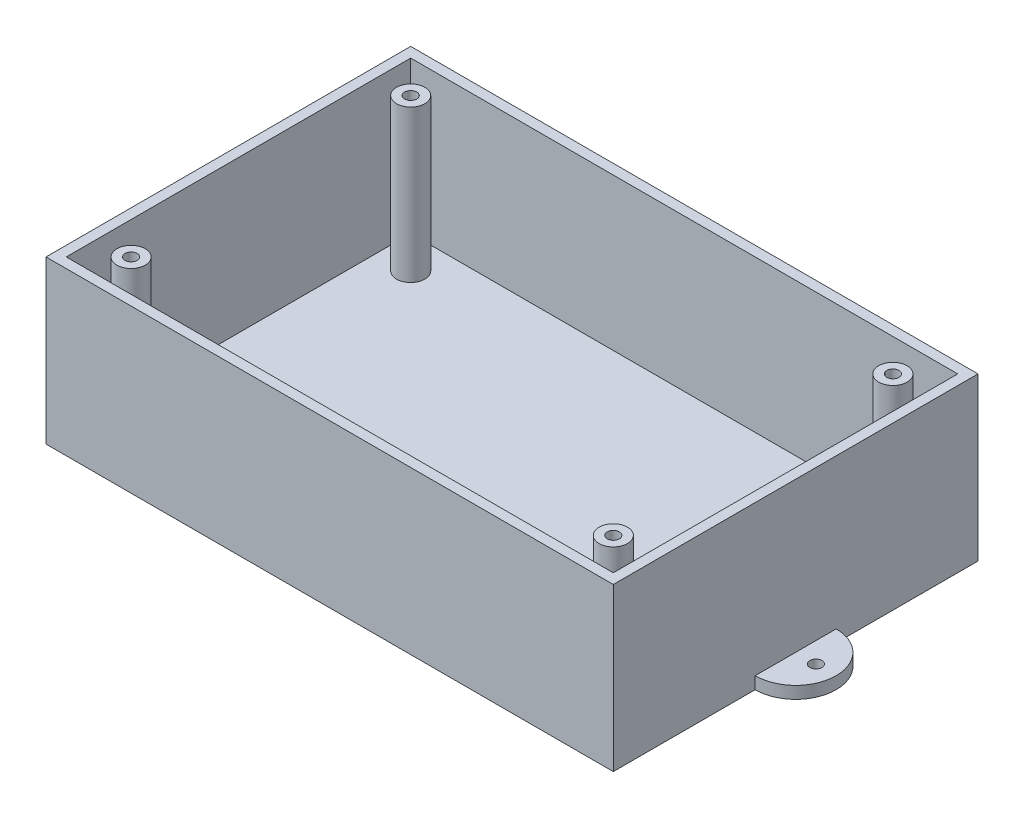
ISO-10303-21;
HEADER;
FILE_DESCRIPTION(('STEP AP214'),'2;1');
FILE_NAME('part.step','',(''),(''),'','','');
FILE_SCHEMA(('AUTOMOTIVE_DESIGN { 1 0 10303 214 1 1 1 1 }'));
ENDSEC;
DATA;
#1=APPLICATION_CONTEXT('core data for automotive mechanical design processes');
#2=APPLICATION_PROTOCOL_DEFINITION('international standard','automotive_design',2000,#1);
#3=PRODUCT_CONTEXT('',#1,'mechanical');
#4=PRODUCT('Part','Part','',(#3));
#5=PRODUCT_RELATED_PRODUCT_CATEGORY('part','',(#4));
#6=PRODUCT_DEFINITION_FORMATION('','',#4);
#7=PRODUCT_DEFINITION_CONTEXT('part definition',#1,'design');
#8=PRODUCT_DEFINITION('design','',#6,#7);
#9=PRODUCT_DEFINITION_SHAPE('','',#8);
#10=(LENGTH_UNIT() NAMED_UNIT(*) SI_UNIT(.MILLI.,.METRE.));
#11=(NAMED_UNIT(*) PLANE_ANGLE_UNIT() SI_UNIT($,.RADIAN.));
#12=(NAMED_UNIT(*) SI_UNIT($,.STERADIAN.) SOLID_ANGLE_UNIT());
#13=UNCERTAINTY_MEASURE_WITH_UNIT(LENGTH_MEASURE(1.E-05),#10,'distance_accuracy_value','');
#14=(GEOMETRIC_REPRESENTATION_CONTEXT(3) GLOBAL_UNCERTAINTY_ASSIGNED_CONTEXT((#13)) GLOBAL_UNIT_ASSIGNED_CONTEXT((#10,
#11,#12)) REPRESENTATION_CONTEXT('',''));
#15=CARTESIAN_POINT('',(0.,0.,0.));
#16=DIRECTION('',(0.,0.,1.));
#17=DIRECTION('',(1.,0.,0.));
#18=AXIS2_PLACEMENT_3D('',#15,#16,#17);
#19=CARTESIAN_POINT('',(0.,40.,0.));
#20=DIRECTION('',(1.,0.,0.));
#21=DIRECTION('',(0.,0.,-1.));
#22=AXIS2_PLACEMENT_3D('',#19,#20,#21);
#23=PLANE('',#22);
#24=DIRECTION('',(0.,-1.,0.));
#25=VECTOR('',#24,1.);
#26=CARTESIAN_POINT('',(0.,3.,-35.));
#27=LINE('',#26,#25);
#28=CARTESIAN_POINT('',(0.,3.,-35.));
#29=VERTEX_POINT('',#28);
#30=CARTESIAN_POINT('',(0.,0.,-35.));
#31=VERTEX_POINT('',#30);
#32=EDGE_CURVE('E166',#29,#31,#27,.T.);
#33=ORIENTED_EDGE('',*,*,#32,.T.);
#34=DIRECTION('',(0.,0.,1.));
#35=VECTOR('',#34,1.);
#36=CARTESIAN_POINT('',(0.,0.,0.));
#37=LINE('',#36,#35);
#38=CARTESIAN_POINT('',(0.,0.,0.));
#39=VERTEX_POINT('',#38);
#40=EDGE_CURVE('E245',#31,#39,#37,.T.);
#41=ORIENTED_EDGE('',*,*,#40,.T.);
#42=DIRECTION('',(0.,-1.,0.));
#43=VECTOR('',#42,1.);
#44=CARTESIAN_POINT('',(0.,40.,0.));
#45=LINE('',#44,#43);
#46=CARTESIAN_POINT('',(0.,40.,0.));
#47=VERTEX_POINT('',#46);
#48=EDGE_CURVE('E11',#47,#39,#45,.T.);
#49=ORIENTED_EDGE('',*,*,#48,.F.);
#50=DIRECTION('',(0.,0.,1.));
#51=VECTOR('',#50,1.);
#52=CARTESIAN_POINT('',(0.,40.,0.));
#53=LINE('',#52,#51);
#54=CARTESIAN_POINT('',(0.,40.,-90.));
#55=VERTEX_POINT('',#54);
#56=EDGE_CURVE('E252',#55,#47,#53,.T.);
#57=ORIENTED_EDGE('',*,*,#56,.F.);
#58=DIRECTION('',(0.,-1.,0.));
#59=VECTOR('',#58,1.);
#60=CARTESIAN_POINT('',(0.,40.,-90.));
#61=LINE('',#60,#59);
#62=CARTESIAN_POINT('',(0.,0.,-90.));
#63=VERTEX_POINT('',#62);
#64=EDGE_CURVE('E261',#55,#63,#61,.T.);
#65=ORIENTED_EDGE('',*,*,#64,.T.);
#66=CARTESIAN_POINT('',(0.,0.,-55.));
#67=VERTEX_POINT('',#66);
#68=EDGE_CURVE('E262',#63,#67,#37,.T.);
#69=ORIENTED_EDGE('',*,*,#68,.T.);
#70=DIRECTION('',(0.,-1.,0.));
#71=VECTOR('',#70,1.);
#72=CARTESIAN_POINT('',(0.,3.,-55.));
#73=LINE('',#72,#71);
#74=CARTESIAN_POINT('',(0.,3.,-55.));
#75=VERTEX_POINT('',#74);
#76=EDGE_CURVE('E163',#75,#67,#73,.T.);
#77=ORIENTED_EDGE('',*,*,#76,.F.);
#78=DIRECTION('',(0.,0.,-1.));
#79=VECTOR('',#78,1.);
#80=CARTESIAN_POINT('',(0.,3.,0.));
#81=LINE('',#80,#79);
#82=EDGE_CURVE('E160',#29,#75,#81,.T.);
#83=ORIENTED_EDGE('',*,*,#82,.F.);
#84=EDGE_LOOP('',(#33,#41,#49,#57,#65,#69,#77,#83));
#85=FACE_BOUND('',#84,.T.);
#86=ADVANCED_FACE('F40',(#85),#23,.F.);
#87=CARTESIAN_POINT('',(0.,40.,0.));
#88=DIRECTION('',(0.,0.,-1.));
#89=DIRECTION('',(-1.,0.,0.));
#90=AXIS2_PLACEMENT_3D('',#87,#88,#89);
#91=PLANE('',#90);
#92=DIRECTION('',(1.,0.,0.));
#93=VECTOR('',#92,1.);
#94=CARTESIAN_POINT('',(0.,0.,0.));
#95=LINE('',#94,#93);
#96=CARTESIAN_POINT('',(140.,0.,0.));
#97=VERTEX_POINT('',#96);
#98=EDGE_CURVE('E139',#39,#97,#95,.T.);
#99=ORIENTED_EDGE('',*,*,#98,.T.);
#100=DIRECTION('',(0.,-1.,0.));
#101=VECTOR('',#100,1.);
#102=CARTESIAN_POINT('',(140.,40.,0.));
#103=LINE('',#102,#101);
#104=CARTESIAN_POINT('',(140.,40.,0.));
#105=VERTEX_POINT('',#104);
#106=EDGE_CURVE('E48',#105,#97,#103,.T.);
#107=ORIENTED_EDGE('',*,*,#106,.F.);
#108=DIRECTION('',(1.,0.,0.));
#109=VECTOR('',#108,1.);
#110=CARTESIAN_POINT('',(0.,40.,0.));
#111=LINE('',#110,#109);
#112=EDGE_CURVE('E255',#47,#105,#111,.T.);
#113=ORIENTED_EDGE('',*,*,#112,.F.);
#114=ORIENTED_EDGE('',*,*,#48,.T.);
#115=EDGE_LOOP('',(#99,#107,#113,#114));
#116=FACE_BOUND('',#115,.T.);
#117=ADVANCED_FACE('F304',(#116),#91,.F.);
#118=CARTESIAN_POINT('',(140.,40.,0.));
#119=DIRECTION('',(-1.,0.,0.));
#120=DIRECTION('',(0.,0.,1.));
#121=AXIS2_PLACEMENT_3D('',#118,#119,#120);
#122=PLANE('',#121);
#123=DIRECTION('',(0.,0.,1.));
#124=VECTOR('',#123,1.);
#125=CARTESIAN_POINT('',(140.,3.,0.));
#126=LINE('',#125,#124);
#127=CARTESIAN_POINT('',(140.,3.,-55.));
#128=VERTEX_POINT('',#127);
#129=CARTESIAN_POINT('',(140.,3.,-35.));
#130=VERTEX_POINT('',#129);
#131=EDGE_CURVE('E60',#128,#130,#126,.T.);
#132=ORIENTED_EDGE('',*,*,#131,.F.);
#133=DIRECTION('',(0.,-1.,0.));
#134=VECTOR('',#133,1.);
#135=CARTESIAN_POINT('',(140.,3.,-55.));
#136=LINE('',#135,#134);
#137=CARTESIAN_POINT('',(140.,0.,-55.));
#138=VERTEX_POINT('',#137);
#139=EDGE_CURVE('E141',#128,#138,#136,.T.);
#140=ORIENTED_EDGE('',*,*,#139,.T.);
#141=DIRECTION('',(0.,0.,-1.));
#142=VECTOR('',#141,1.);
#143=CARTESIAN_POINT('',(140.,0.,0.));
#144=LINE('',#143,#142);
#145=CARTESIAN_POINT('',(140.,0.,-90.));
#146=VERTEX_POINT('',#145);
#147=EDGE_CURVE('E129',#138,#146,#144,.T.);
#148=ORIENTED_EDGE('',*,*,#147,.T.);
#149=DIRECTION('',(0.,-1.,0.));
#150=VECTOR('',#149,1.);
#151=CARTESIAN_POINT('',(140.,40.,-90.));
#152=LINE('',#151,#150);
#153=CARTESIAN_POINT('',(140.,40.,-90.));
#154=VERTEX_POINT('',#153);
#155=EDGE_CURVE('E268',#154,#146,#152,.T.);
#156=ORIENTED_EDGE('',*,*,#155,.F.);
#157=DIRECTION('',(0.,0.,-1.));
#158=VECTOR('',#157,1.);
#159=CARTESIAN_POINT('',(140.,40.,0.));
#160=LINE('',#159,#158);
#161=EDGE_CURVE('E257',#105,#154,#160,.T.);
#162=ORIENTED_EDGE('',*,*,#161,.F.);
#163=ORIENTED_EDGE('',*,*,#106,.T.);
#164=CARTESIAN_POINT('',(140.,0.,-35.));
#165=VERTEX_POINT('',#164);
#166=EDGE_CURVE('E138',#97,#165,#144,.T.);
#167=ORIENTED_EDGE('',*,*,#166,.T.);
#168=DIRECTION('',(0.,-1.,0.));
#169=VECTOR('',#168,1.);
#170=CARTESIAN_POINT('',(140.,3.,-35.));
#171=LINE('',#170,#169);
#172=EDGE_CURVE('E56',#130,#165,#171,.T.);
#173=ORIENTED_EDGE('',*,*,#172,.F.);
#174=EDGE_LOOP('',(#132,#140,#148,#156,#162,#163,#167,#173));
#175=FACE_BOUND('',#174,.T.);
#176=ADVANCED_FACE('F142',(#175),#122,.F.);
#177=CARTESIAN_POINT('',(0.,40.,-90.));
#178=DIRECTION('',(0.,0.,1.));
#179=DIRECTION('',(1.,0.,0.));
#180=AXIS2_PLACEMENT_3D('',#177,#178,#179);
#181=PLANE('',#180);
#182=DIRECTION('',(-1.,0.,0.));
#183=VECTOR('',#182,1.);
#184=CARTESIAN_POINT('',(0.,0.,-90.));
#185=LINE('',#184,#183);
#186=EDGE_CURVE('E135',#146,#63,#185,.T.);
#187=ORIENTED_EDGE('',*,*,#186,.T.);
#188=ORIENTED_EDGE('',*,*,#64,.F.);
#189=DIRECTION('',(-1.,0.,0.));
#190=VECTOR('',#189,1.);
#191=CARTESIAN_POINT('',(0.,40.,-90.));
#192=LINE('',#191,#190);
#193=EDGE_CURVE('E259',#154,#55,#192,.T.);
#194=ORIENTED_EDGE('',*,*,#193,.F.);
#195=ORIENTED_EDGE('',*,*,#155,.T.);
#196=EDGE_LOOP('',(#187,#188,#194,#195));
#197=FACE_BOUND('',#196,.T.);
#198=ADVANCED_FACE('F299',(#197),#181,.F.);
#199=CARTESIAN_POINT('',(0.,40.,0.));
#200=DIRECTION('',(0.,-1.,0.));
#201=DIRECTION('',(0.,0.,-1.));
#202=AXIS2_PLACEMENT_3D('',#199,#200,#201);
#203=PLANE('',#202);
#204=DIRECTION('',(-1.,0.,0.));
#205=VECTOR('',#204,1.);
#206=CARTESIAN_POINT('',(2.5,40.,-87.5));
#207=LINE('',#206,#205);
#208=CARTESIAN_POINT('',(137.5,40.,-87.5));
#209=VERTEX_POINT('',#208);
#210=CARTESIAN_POINT('',(2.5,40.,-87.5));
#211=VERTEX_POINT('',#210);
#212=EDGE_CURVE('E235',#209,#211,#207,.T.);
#213=ORIENTED_EDGE('',*,*,#212,.F.);
#214=DIRECTION('',(0.,0.,-1.));
#215=VECTOR('',#214,1.);
#216=CARTESIAN_POINT('',(137.5,40.,-87.5));
#217=LINE('',#216,#215);
#218=CARTESIAN_POINT('',(137.5,40.,-2.50000000000001));
#219=VERTEX_POINT('',#218);
#220=EDGE_CURVE('E217',#219,#209,#217,.T.);
#221=ORIENTED_EDGE('',*,*,#220,.F.);
#222=DIRECTION('',(1.,0.,0.));
#223=VECTOR('',#222,1.);
#224=CARTESIAN_POINT('',(2.5,40.,-2.50000000000001));
#225=LINE('',#224,#223);
#226=CARTESIAN_POINT('',(2.5,40.,-2.50000000000001));
#227=VERTEX_POINT('',#226);
#228=EDGE_CURVE('E224',#227,#219,#225,.T.);
#229=ORIENTED_EDGE('',*,*,#228,.F.);
#230=DIRECTION('',(0.,0.,1.));
#231=VECTOR('',#230,1.);
#232=CARTESIAN_POINT('',(2.5,40.,-87.5));
#233=LINE('',#232,#231);
#234=EDGE_CURVE('E238',#211,#227,#233,.T.);
#235=ORIENTED_EDGE('',*,*,#234,.F.);
#236=EDGE_LOOP('',(#213,#221,#229,#235));
#237=FACE_BOUND('',#236,.T.);
#238=ORIENTED_EDGE('',*,*,#56,.T.);
#239=ORIENTED_EDGE('',*,*,#112,.T.);
#240=ORIENTED_EDGE('',*,*,#161,.T.);
#241=ORIENTED_EDGE('',*,*,#193,.T.);
#242=EDGE_LOOP('',(#238,#239,#240,#241));
#243=FACE_BOUND('',#242,.T.);
#244=ADVANCED_FACE('F289',(#237,#243),#203,.F.);
#245=CARTESIAN_POINT('',(0.,0.,0.));
#246=DIRECTION('',(0.,-1.,0.));
#247=DIRECTION('',(0.,0.,-1.));
#248=AXIS2_PLACEMENT_3D('',#245,#246,#247);
#249=PLANE('',#248);
#250=CARTESIAN_POINT('',(-4.99999999999999,0.,-45.));
#251=DIRECTION('',(0.,-1.,0.));
#252=DIRECTION('',(0.,0.,-1.));
#253=AXIS2_PLACEMENT_3D('',#250,#251,#252);
#254=CIRCLE('',#253,1.5);
#255=CARTESIAN_POINT('',(-4.99999999999999,0.,-46.5));
#256=VERTEX_POINT('',#255);
#257=EDGE_CURVE('E272',#256,#256,#254,.T.);
#258=ORIENTED_EDGE('',*,*,#257,.F.);
#259=EDGE_LOOP('',(#258));
#260=FACE_BOUND('',#259,.T.);
#261=CARTESIAN_POINT('',(145.,0.,-45.));
#262=DIRECTION('',(0.,-1.,0.));
#263=DIRECTION('',(0.,0.,-1.));
#264=AXIS2_PLACEMENT_3D('',#261,#262,#263);
#265=CIRCLE('',#264,1.5);
#266=CARTESIAN_POINT('',(145.,0.,-46.5));
#267=VERTEX_POINT('',#266);
#268=EDGE_CURVE('E276',#267,#267,#265,.T.);
#269=ORIENTED_EDGE('',*,*,#268,.F.);
#270=EDGE_LOOP('',(#269));
#271=FACE_BOUND('',#270,.T.);
#272=ORIENTED_EDGE('',*,*,#68,.F.);
#273=ORIENTED_EDGE('',*,*,#186,.F.);
#274=ORIENTED_EDGE('',*,*,#147,.F.);
#275=CARTESIAN_POINT('',(140.,0.,-45.));
#276=DIRECTION('',(0.,-1.,0.));
#277=DIRECTION('',(0.,0.,-1.));
#278=AXIS2_PLACEMENT_3D('',#275,#276,#277);
#279=CIRCLE('',#278,10.);
#280=EDGE_CURVE('E134',#138,#165,#279,.T.);
#281=ORIENTED_EDGE('',*,*,#280,.T.);
#282=ORIENTED_EDGE('',*,*,#166,.F.);
#283=ORIENTED_EDGE('',*,*,#98,.F.);
#284=ORIENTED_EDGE('',*,*,#40,.F.);
#285=CARTESIAN_POINT('',(0.,0.,-45.));
#286=DIRECTION('',(0.,-1.,0.));
#287=DIRECTION('',(0.,0.,-1.));
#288=AXIS2_PLACEMENT_3D('',#285,#286,#287);
#289=CIRCLE('',#288,10.);
#290=EDGE_CURVE('E155',#67,#31,#289,.F.);
#291=ORIENTED_EDGE('',*,*,#290,.F.);
#292=EDGE_LOOP('',(#272,#273,#274,#281,#282,#283,#284,#291));
#293=FACE_BOUND('',#292,.T.);
#294=ADVANCED_FACE('F131',(#260,#271,#293),#249,.T.);
#295=CARTESIAN_POINT('',(137.5,2.5,-87.5));
#296=DIRECTION('',(1.,0.,0.));
#297=DIRECTION('',(0.,0.,-1.));
#298=AXIS2_PLACEMENT_3D('',#295,#296,#297);
#299=PLANE('',#298);
#300=ORIENTED_EDGE('',*,*,#220,.T.);
#301=DIRECTION('',(0.,1.,0.));
#302=VECTOR('',#301,1.);
#303=CARTESIAN_POINT('',(137.5,2.5,-87.5));
#304=LINE('',#303,#302);
#305=CARTESIAN_POINT('',(137.5,2.5,-87.5));
#306=VERTEX_POINT('',#305);
#307=EDGE_CURVE('E233',#306,#209,#304,.T.);
#308=ORIENTED_EDGE('',*,*,#307,.F.);
#309=DIRECTION('',(0.,0.,-1.));
#310=VECTOR('',#309,1.);
#311=CARTESIAN_POINT('',(137.5,2.5,-87.5));
#312=LINE('',#311,#310);
#313=CARTESIAN_POINT('',(137.5,2.5,-2.50000000000001));
#314=VERTEX_POINT('',#313);
#315=EDGE_CURVE('E220',#314,#306,#312,.T.);
#316=ORIENTED_EDGE('',*,*,#315,.F.);
#317=DIRECTION('',(0.,1.,0.));
#318=VECTOR('',#317,1.);
#319=CARTESIAN_POINT('',(137.5,2.5,-2.50000000000001));
#320=LINE('',#319,#318);
#321=EDGE_CURVE('E243',#314,#219,#320,.T.);
#322=ORIENTED_EDGE('',*,*,#321,.T.);
#323=EDGE_LOOP('',(#300,#308,#316,#322));
#324=FACE_BOUND('',#323,.T.);
#325=ADVANCED_FACE('F288',(#324),#299,.F.);
#326=CARTESIAN_POINT('',(2.5,2.5,-2.50000000000001));
#327=DIRECTION('',(0.,0.,1.));
#328=DIRECTION('',(1.,0.,0.));
#329=AXIS2_PLACEMENT_3D('',#326,#327,#328);
#330=PLANE('',#329);
#331=ORIENTED_EDGE('',*,*,#228,.T.);
#332=ORIENTED_EDGE('',*,*,#321,.F.);
#333=DIRECTION('',(1.,0.,0.));
#334=VECTOR('',#333,1.);
#335=CARTESIAN_POINT('',(2.5,2.5,-2.50000000000001));
#336=LINE('',#335,#334);
#337=CARTESIAN_POINT('',(2.5,2.5,-2.50000000000001));
#338=VERTEX_POINT('',#337);
#339=EDGE_CURVE('E230',#338,#314,#336,.T.);
#340=ORIENTED_EDGE('',*,*,#339,.F.);
#341=DIRECTION('',(0.,1.,0.));
#342=VECTOR('',#341,1.);
#343=CARTESIAN_POINT('',(2.5,2.5,-2.50000000000001));
#344=LINE('',#343,#342);
#345=EDGE_CURVE('E246',#338,#227,#344,.T.);
#346=ORIENTED_EDGE('',*,*,#345,.T.);
#347=EDGE_LOOP('',(#331,#332,#340,#346));
#348=FACE_BOUND('',#347,.T.);
#349=ADVANCED_FACE('F296',(#348),#330,.F.);
#350=CARTESIAN_POINT('',(2.5,2.5,-87.5));
#351=DIRECTION('',(-1.,0.,0.));
#352=DIRECTION('',(0.,0.,1.));
#353=AXIS2_PLACEMENT_3D('',#350,#351,#352);
#354=PLANE('',#353);
#355=ORIENTED_EDGE('',*,*,#234,.T.);
#356=ORIENTED_EDGE('',*,*,#345,.F.);
#357=DIRECTION('',(0.,0.,1.));
#358=VECTOR('',#357,1.);
#359=CARTESIAN_POINT('',(2.5,2.5,-87.5));
#360=LINE('',#359,#358);
#361=CARTESIAN_POINT('',(2.5,2.5,-87.5));
#362=VERTEX_POINT('',#361);
#363=EDGE_CURVE('E227',#362,#338,#360,.T.);
#364=ORIENTED_EDGE('',*,*,#363,.F.);
#365=DIRECTION('',(0.,1.,0.));
#366=VECTOR('',#365,1.);
#367=CARTESIAN_POINT('',(2.5,2.5,-87.5));
#368=LINE('',#367,#366);
#369=EDGE_CURVE('E248',#362,#211,#368,.T.);
#370=ORIENTED_EDGE('',*,*,#369,.T.);
#371=EDGE_LOOP('',(#355,#356,#364,#370));
#372=FACE_BOUND('',#371,.T.);
#373=ADVANCED_FACE('F362',(#372),#354,.F.);
#374=CARTESIAN_POINT('',(2.5,2.5,-87.5));
#375=DIRECTION('',(0.,0.,-1.));
#376=DIRECTION('',(-1.,0.,0.));
#377=AXIS2_PLACEMENT_3D('',#374,#375,#376);
#378=PLANE('',#377);
#379=ORIENTED_EDGE('',*,*,#212,.T.);
#380=ORIENTED_EDGE('',*,*,#369,.F.);
#381=DIRECTION('',(-1.,0.,0.));
#382=VECTOR('',#381,1.);
#383=CARTESIAN_POINT('',(2.5,2.5,-87.5));
#384=LINE('',#383,#382);
#385=EDGE_CURVE('E223',#306,#362,#384,.T.);
#386=ORIENTED_EDGE('',*,*,#385,.F.);
#387=ORIENTED_EDGE('',*,*,#307,.T.);
#388=EDGE_LOOP('',(#379,#380,#386,#387));
#389=FACE_BOUND('',#388,.T.);
#390=ADVANCED_FACE('F372',(#389),#378,.F.);
#391=CARTESIAN_POINT('',(0.,2.5,0.));
#392=DIRECTION('',(0.,1.,0.));
#393=DIRECTION('',(0.,0.,1.));
#394=AXIS2_PLACEMENT_3D('',#391,#392,#393);
#395=PLANE('',#394);
#396=CARTESIAN_POINT('',(129.5,2.5,-79.5));
#397=DIRECTION('',(0.,1.,0.));
#398=DIRECTION('',(0.,0.,1.));
#399=AXIS2_PLACEMENT_3D('',#396,#397,#398);
#400=CIRCLE('',#399,3.49999999999999);
#401=CARTESIAN_POINT('',(129.5,2.5,-76.));
#402=VERTEX_POINT('',#401);
#403=EDGE_CURVE('E193',#402,#402,#400,.T.);
#404=ORIENTED_EDGE('',*,*,#403,.F.);
#405=EDGE_LOOP('',(#404));
#406=FACE_BOUND('',#405,.T.);
#407=CARTESIAN_POINT('',(129.5,2.5,-10.5));
#408=DIRECTION('',(0.,1.,0.));
#409=DIRECTION('',(0.,0.,1.));
#410=AXIS2_PLACEMENT_3D('',#407,#408,#409);
#411=CIRCLE('',#410,3.49999999999999);
#412=CARTESIAN_POINT('',(129.5,2.5,-7.00000000000002));
#413=VERTEX_POINT('',#412);
#414=EDGE_CURVE('E199',#413,#413,#411,.T.);
#415=ORIENTED_EDGE('',*,*,#414,.F.);
#416=EDGE_LOOP('',(#415));
#417=FACE_BOUND('',#416,.T.);
#418=CARTESIAN_POINT('',(10.5,2.5,-10.5));
#419=DIRECTION('',(0.,1.,0.));
#420=DIRECTION('',(0.,0.,1.));
#421=AXIS2_PLACEMENT_3D('',#418,#419,#420);
#422=CIRCLE('',#421,3.5);
#423=CARTESIAN_POINT('',(10.5,2.5,-7.00000000000001));
#424=VERTEX_POINT('',#423);
#425=EDGE_CURVE('E205',#424,#424,#422,.T.);
#426=ORIENTED_EDGE('',*,*,#425,.F.);
#427=EDGE_LOOP('',(#426));
#428=FACE_BOUND('',#427,.T.);
#429=CARTESIAN_POINT('',(10.5,2.5,-79.5));
#430=DIRECTION('',(0.,1.,0.));
#431=DIRECTION('',(0.,0.,1.));
#432=AXIS2_PLACEMENT_3D('',#429,#430,#431);
#433=CIRCLE('',#432,3.5);
#434=CARTESIAN_POINT('',(10.5,2.5,-76.));
#435=VERTEX_POINT('',#434);
#436=EDGE_CURVE('E211',#435,#435,#433,.T.);
#437=ORIENTED_EDGE('',*,*,#436,.F.);
#438=EDGE_LOOP('',(#437));
#439=FACE_BOUND('',#438,.T.);
#440=ORIENTED_EDGE('',*,*,#315,.T.);
#441=ORIENTED_EDGE('',*,*,#385,.T.);
#442=ORIENTED_EDGE('',*,*,#363,.T.);
#443=ORIENTED_EDGE('',*,*,#339,.T.);
#444=EDGE_LOOP('',(#440,#441,#442,#443));
#445=FACE_BOUND('',#444,.T.);
#446=ADVANCED_FACE('F382',(#406,#417,#428,#439,#445),#395,.T.);
#447=CARTESIAN_POINT('',(10.5,40.,-79.5));
#448=DIRECTION('',(0.,-1.,0.));
#449=DIRECTION('',(0.,0.,-1.));
#450=AXIS2_PLACEMENT_3D('',#447,#448,#449);
#451=CYLINDRICAL_SURFACE('',#450,3.5);
#452=CARTESIAN_POINT('',(10.5,40.,-79.5));
#453=DIRECTION('',(0.,1.,0.));
#454=DIRECTION('',(0.,0.,1.));
#455=AXIS2_PLACEMENT_3D('',#452,#453,#454);
#456=CIRCLE('',#455,3.5);
#457=CARTESIAN_POINT('',(10.5,40.,-76.));
#458=VERTEX_POINT('',#457);
#459=EDGE_CURVE('E214',#458,#458,#456,.T.);
#460=ORIENTED_EDGE('',*,*,#459,.F.);
#461=EDGE_LOOP('',(#460));
#462=FACE_BOUND('',#461,.T.);
#463=ORIENTED_EDGE('',*,*,#436,.T.);
#464=EDGE_LOOP('',(#463));
#465=FACE_BOUND('',#464,.T.);
#466=ADVANCED_FACE('F392',(#462,#465),#451,.T.);
#467=CARTESIAN_POINT('',(10.5,40.,-79.5));
#468=DIRECTION('',(0.,1.,0.));
#469=DIRECTION('',(0.,0.,1.));
#470=AXIS2_PLACEMENT_3D('',#467,#468,#469);
#471=PLANE('',#470);
#472=CARTESIAN_POINT('',(10.5,40.,-79.5));
#473=DIRECTION('',(0.,1.,0.));
#474=DIRECTION('',(0.,0.,1.));
#475=AXIS2_PLACEMENT_3D('',#472,#473,#474);
#476=CIRCLE('',#475,1.5);
#477=CARTESIAN_POINT('',(10.5,40.,-78.));
#478=VERTEX_POINT('',#477);
#479=EDGE_CURVE('E181',#478,#478,#476,.T.);
#480=ORIENTED_EDGE('',*,*,#479,.F.);
#481=EDGE_LOOP('',(#480));
#482=FACE_BOUND('',#481,.T.);
#483=ORIENTED_EDGE('',*,*,#459,.T.);
#484=EDGE_LOOP('',(#483));
#485=FACE_BOUND('',#484,.T.);
#486=ADVANCED_FACE('F402',(#482,#485),#471,.T.);
#487=CARTESIAN_POINT('',(10.5,40.,-10.5));
#488=DIRECTION('',(0.,-1.,0.));
#489=DIRECTION('',(0.,0.,-1.));
#490=AXIS2_PLACEMENT_3D('',#487,#488,#489);
#491=CYLINDRICAL_SURFACE('',#490,3.5);
#492=CARTESIAN_POINT('',(10.5,40.,-10.5));
#493=DIRECTION('',(0.,1.,0.));
#494=DIRECTION('',(0.,0.,1.));
#495=AXIS2_PLACEMENT_3D('',#492,#493,#494);
#496=CIRCLE('',#495,3.5);
#497=CARTESIAN_POINT('',(10.5,40.,-7.00000000000001));
#498=VERTEX_POINT('',#497);
#499=EDGE_CURVE('E208',#498,#498,#496,.T.);
#500=ORIENTED_EDGE('',*,*,#499,.F.);
#501=EDGE_LOOP('',(#500));
#502=FACE_BOUND('',#501,.T.);
#503=ORIENTED_EDGE('',*,*,#425,.T.);
#504=EDGE_LOOP('',(#503));
#505=FACE_BOUND('',#504,.T.);
#506=ADVANCED_FACE('F410',(#502,#505),#491,.T.);
#507=CARTESIAN_POINT('',(10.5,40.,-10.5));
#508=DIRECTION('',(0.,1.,0.));
#509=DIRECTION('',(0.,0.,1.));
#510=AXIS2_PLACEMENT_3D('',#507,#508,#509);
#511=PLANE('',#510);
#512=CARTESIAN_POINT('',(10.5,40.,-10.5));
#513=DIRECTION('',(0.,1.,0.));
#514=DIRECTION('',(0.,0.,1.));
#515=AXIS2_PLACEMENT_3D('',#512,#513,#514);
#516=CIRCLE('',#515,1.5);
#517=CARTESIAN_POINT('',(10.5,40.,-9.00000000000001));
#518=VERTEX_POINT('',#517);
#519=EDGE_CURVE('E175',#518,#518,#516,.T.);
#520=ORIENTED_EDGE('',*,*,#519,.F.);
#521=EDGE_LOOP('',(#520));
#522=FACE_BOUND('',#521,.T.);
#523=ORIENTED_EDGE('',*,*,#499,.T.);
#524=EDGE_LOOP('',(#523));
#525=FACE_BOUND('',#524,.T.);
#526=ADVANCED_FACE('F415',(#522,#525),#511,.T.);
#527=CARTESIAN_POINT('',(129.5,40.,-10.5));
#528=DIRECTION('',(0.,-1.,0.));
#529=DIRECTION('',(0.,0.,-1.));
#530=AXIS2_PLACEMENT_3D('',#527,#528,#529);
#531=CYLINDRICAL_SURFACE('',#530,3.49999999999999);
#532=CARTESIAN_POINT('',(129.5,40.,-10.5));
#533=DIRECTION('',(0.,1.,0.));
#534=DIRECTION('',(0.,0.,1.));
#535=AXIS2_PLACEMENT_3D('',#532,#533,#534);
#536=CIRCLE('',#535,3.49999999999999);
#537=CARTESIAN_POINT('',(129.5,40.,-7.00000000000002));
#538=VERTEX_POINT('',#537);
#539=EDGE_CURVE('E202',#538,#538,#536,.T.);
#540=ORIENTED_EDGE('',*,*,#539,.F.);
#541=EDGE_LOOP('',(#540));
#542=FACE_BOUND('',#541,.T.);
#543=ORIENTED_EDGE('',*,*,#414,.T.);
#544=EDGE_LOOP('',(#543));
#545=FACE_BOUND('',#544,.T.);
#546=ADVANCED_FACE('F423',(#542,#545),#531,.T.);
#547=CARTESIAN_POINT('',(129.5,40.,-10.5));
#548=DIRECTION('',(0.,1.,0.));
#549=DIRECTION('',(0.,0.,1.));
#550=AXIS2_PLACEMENT_3D('',#547,#548,#549);
#551=PLANE('',#550);
#552=CARTESIAN_POINT('',(129.5,40.,-10.5));
#553=DIRECTION('',(0.,1.,0.));
#554=DIRECTION('',(0.,0.,1.));
#555=AXIS2_PLACEMENT_3D('',#552,#553,#554);
#556=CIRCLE('',#555,1.5);
#557=CARTESIAN_POINT('',(129.5,40.,-9.00000000000001));
#558=VERTEX_POINT('',#557);
#559=EDGE_CURVE('E169',#558,#558,#556,.T.);
#560=ORIENTED_EDGE('',*,*,#559,.F.);
#561=EDGE_LOOP('',(#560));
#562=FACE_BOUND('',#561,.T.);
#563=ORIENTED_EDGE('',*,*,#539,.T.);
#564=EDGE_LOOP('',(#563));
#565=FACE_BOUND('',#564,.T.);
#566=ADVANCED_FACE('F428',(#562,#565),#551,.T.);
#567=CARTESIAN_POINT('',(129.5,40.,-79.5));
#568=DIRECTION('',(0.,-1.,0.));
#569=DIRECTION('',(0.,0.,-1.));
#570=AXIS2_PLACEMENT_3D('',#567,#568,#569);
#571=CYLINDRICAL_SURFACE('',#570,3.49999999999999);
#572=CARTESIAN_POINT('',(129.5,40.,-79.5));
#573=DIRECTION('',(0.,1.,0.));
#574=DIRECTION('',(0.,0.,1.));
#575=AXIS2_PLACEMENT_3D('',#572,#573,#574);
#576=CIRCLE('',#575,3.49999999999999);
#577=CARTESIAN_POINT('',(129.5,40.,-76.));
#578=VERTEX_POINT('',#577);
#579=EDGE_CURVE('E196',#578,#578,#576,.T.);
#580=ORIENTED_EDGE('',*,*,#579,.F.);
#581=EDGE_LOOP('',(#580));
#582=FACE_BOUND('',#581,.T.);
#583=ORIENTED_EDGE('',*,*,#403,.T.);
#584=EDGE_LOOP('',(#583));
#585=FACE_BOUND('',#584,.T.);
#586=ADVANCED_FACE('F436',(#582,#585),#571,.T.);
#587=CARTESIAN_POINT('',(129.5,40.,-79.5));
#588=DIRECTION('',(0.,1.,0.));
#589=DIRECTION('',(0.,0.,1.));
#590=AXIS2_PLACEMENT_3D('',#587,#588,#589);
#591=PLANE('',#590);
#592=CARTESIAN_POINT('',(129.5,40.,-79.5));
#593=DIRECTION('',(0.,1.,0.));
#594=DIRECTION('',(0.,0.,1.));
#595=AXIS2_PLACEMENT_3D('',#592,#593,#594);
#596=CIRCLE('',#595,1.5);
#597=CARTESIAN_POINT('',(129.5,40.,-78.));
#598=VERTEX_POINT('',#597);
#599=EDGE_CURVE('E182',#598,#598,#596,.T.);
#600=ORIENTED_EDGE('',*,*,#599,.F.);
#601=EDGE_LOOP('',(#600));
#602=FACE_BOUND('',#601,.T.);
#603=ORIENTED_EDGE('',*,*,#579,.T.);
#604=EDGE_LOOP('',(#603));
#605=FACE_BOUND('',#604,.T.);
#606=ADVANCED_FACE('F441',(#602,#605),#591,.T.);
#607=CARTESIAN_POINT('',(129.5,2.5,-79.5));
#608=DIRECTION('',(0.,1.,0.));
#609=DIRECTION('',(0.,0.,1.));
#610=AXIS2_PLACEMENT_3D('',#607,#608,#609);
#611=CYLINDRICAL_SURFACE('',#610,1.5);
#612=CARTESIAN_POINT('',(129.5,2.5,-79.5));
#613=DIRECTION('',(0.,1.,0.));
#614=DIRECTION('',(0.,0.,1.));
#615=AXIS2_PLACEMENT_3D('',#612,#613,#614);
#616=CIRCLE('',#615,1.5);
#617=CARTESIAN_POINT('',(129.5,2.5,-78.));
#618=VERTEX_POINT('',#617);
#619=EDGE_CURVE('E178',#618,#618,#616,.T.);
#620=ORIENTED_EDGE('',*,*,#619,.F.);
#621=EDGE_LOOP('',(#620));
#622=FACE_BOUND('',#621,.T.);
#623=ORIENTED_EDGE('',*,*,#599,.T.);
#624=EDGE_LOOP('',(#623));
#625=FACE_BOUND('',#624,.T.);
#626=ADVANCED_FACE('F472',(#622,#625),#611,.F.);
#627=CARTESIAN_POINT('',(129.5,2.5,-79.5));
#628=DIRECTION('',(0.,1.,0.));
#629=DIRECTION('',(0.,0.,1.));
#630=AXIS2_PLACEMENT_3D('',#627,#628,#629);
#631=PLANE('',#630);
#632=ORIENTED_EDGE('',*,*,#619,.T.);
#633=EDGE_LOOP('',(#632));
#634=FACE_BOUND('',#633,.T.);
#635=ADVANCED_FACE('F482',(#634),#631,.T.);
#636=CARTESIAN_POINT('',(129.5,2.5,-10.5));
#637=DIRECTION('',(0.,1.,0.));
#638=DIRECTION('',(0.,0.,1.));
#639=AXIS2_PLACEMENT_3D('',#636,#637,#638);
#640=CYLINDRICAL_SURFACE('',#639,1.5);
#641=CARTESIAN_POINT('',(129.5,2.5,-10.5));
#642=DIRECTION('',(0.,1.,0.));
#643=DIRECTION('',(0.,0.,1.));
#644=AXIS2_PLACEMENT_3D('',#641,#642,#643);
#645=CIRCLE('',#644,1.5);
#646=CARTESIAN_POINT('',(129.5,2.5,-9.00000000000001));
#647=VERTEX_POINT('',#646);
#648=EDGE_CURVE('E172',#647,#647,#645,.T.);
#649=ORIENTED_EDGE('',*,*,#648,.F.);
#650=EDGE_LOOP('',(#649));
#651=FACE_BOUND('',#650,.T.);
#652=ORIENTED_EDGE('',*,*,#559,.T.);
#653=EDGE_LOOP('',(#652));
#654=FACE_BOUND('',#653,.T.);
#655=ADVANCED_FACE('F492',(#651,#654),#640,.F.);
#656=CARTESIAN_POINT('',(129.5,2.5,-10.5));
#657=DIRECTION('',(0.,1.,0.));
#658=DIRECTION('',(0.,0.,1.));
#659=AXIS2_PLACEMENT_3D('',#656,#657,#658);
#660=PLANE('',#659);
#661=ORIENTED_EDGE('',*,*,#648,.T.);
#662=EDGE_LOOP('',(#661));
#663=FACE_BOUND('',#662,.T.);
#664=ADVANCED_FACE('F502',(#663),#660,.T.);
#665=CARTESIAN_POINT('',(10.5,2.5,-10.5));
#666=DIRECTION('',(0.,1.,0.));
#667=DIRECTION('',(0.,0.,1.));
#668=AXIS2_PLACEMENT_3D('',#665,#666,#667);
#669=CYLINDRICAL_SURFACE('',#668,1.5);
#670=CARTESIAN_POINT('',(10.5,2.5,-10.5));
#671=DIRECTION('',(0.,1.,0.));
#672=DIRECTION('',(0.,0.,1.));
#673=AXIS2_PLACEMENT_3D('',#670,#671,#672);
#674=CIRCLE('',#673,1.5);
#675=CARTESIAN_POINT('',(10.5,2.5,-9.00000000000001));
#676=VERTEX_POINT('',#675);
#677=EDGE_CURVE('E185',#676,#676,#674,.T.);
#678=ORIENTED_EDGE('',*,*,#677,.F.);
#679=EDGE_LOOP('',(#678));
#680=FACE_BOUND('',#679,.T.);
#681=ORIENTED_EDGE('',*,*,#519,.T.);
#682=EDGE_LOOP('',(#681));
#683=FACE_BOUND('',#682,.T.);
#684=ADVANCED_FACE('F512',(#680,#683),#669,.F.);
#685=CARTESIAN_POINT('',(10.5,2.5,-10.5));
#686=DIRECTION('',(0.,1.,0.));
#687=DIRECTION('',(0.,0.,1.));
#688=AXIS2_PLACEMENT_3D('',#685,#686,#687);
#689=PLANE('',#688);
#690=ORIENTED_EDGE('',*,*,#677,.T.);
#691=EDGE_LOOP('',(#690));
#692=FACE_BOUND('',#691,.T.);
#693=ADVANCED_FACE('F522',(#692),#689,.T.);
#694=CARTESIAN_POINT('',(10.5,2.5,-79.5));
#695=DIRECTION('',(0.,1.,0.));
#696=DIRECTION('',(0.,0.,1.));
#697=AXIS2_PLACEMENT_3D('',#694,#695,#696);
#698=CYLINDRICAL_SURFACE('',#697,1.5);
#699=CARTESIAN_POINT('',(10.5,2.5,-79.5));
#700=DIRECTION('',(0.,1.,0.));
#701=DIRECTION('',(0.,0.,1.));
#702=AXIS2_PLACEMENT_3D('',#699,#700,#701);
#703=CIRCLE('',#702,1.5);
#704=CARTESIAN_POINT('',(10.5,2.5,-78.));
#705=VERTEX_POINT('',#704);
#706=EDGE_CURVE('E190',#705,#705,#703,.T.);
#707=ORIENTED_EDGE('',*,*,#706,.F.);
#708=EDGE_LOOP('',(#707));
#709=FACE_BOUND('',#708,.T.);
#710=ORIENTED_EDGE('',*,*,#479,.T.);
#711=EDGE_LOOP('',(#710));
#712=FACE_BOUND('',#711,.T.);
#713=ADVANCED_FACE('F532',(#709,#712),#698,.F.);
#714=CARTESIAN_POINT('',(10.5,2.5,-79.5));
#715=DIRECTION('',(0.,1.,0.));
#716=DIRECTION('',(0.,0.,1.));
#717=AXIS2_PLACEMENT_3D('',#714,#715,#716);
#718=PLANE('',#717);
#719=ORIENTED_EDGE('',*,*,#706,.T.);
#720=EDGE_LOOP('',(#719));
#721=FACE_BOUND('',#720,.T.);
#722=ADVANCED_FACE('F542',(#721),#718,.T.);
#723=CARTESIAN_POINT('',(0.,3.,-45.));
#724=DIRECTION('',(0.,-1.,0.));
#725=DIRECTION('',(0.,0.,-1.));
#726=AXIS2_PLACEMENT_3D('',#723,#724,#725);
#727=CYLINDRICAL_SURFACE('',#726,10.);
#728=ORIENTED_EDGE('',*,*,#290,.T.);
#729=ORIENTED_EDGE('',*,*,#32,.F.);
#730=CARTESIAN_POINT('',(0.,3.,-45.));
#731=DIRECTION('',(0.,-1.,0.));
#732=DIRECTION('',(0.,0.,-1.));
#733=AXIS2_PLACEMENT_3D('',#730,#731,#732);
#734=CIRCLE('',#733,10.);
#735=EDGE_CURVE('E157',#75,#29,#734,.F.);
#736=ORIENTED_EDGE('',*,*,#735,.F.);
#737=ORIENTED_EDGE('',*,*,#76,.T.);
#738=EDGE_LOOP('',(#728,#729,#736,#737));
#739=FACE_BOUND('',#738,.T.);
#740=ADVANCED_FACE('F316',(#739),#727,.T.);
#741=CARTESIAN_POINT('',(0.,3.,0.));
#742=DIRECTION('',(0.,-1.,0.));
#743=DIRECTION('',(0.,0.,-1.));
#744=AXIS2_PLACEMENT_3D('',#741,#742,#743);
#745=PLANE('',#744);
#746=CARTESIAN_POINT('',(-4.99999999999999,3.,-45.));
#747=DIRECTION('',(0.,-1.,0.));
#748=DIRECTION('',(0.,0.,-1.));
#749=AXIS2_PLACEMENT_3D('',#746,#747,#748);
#750=CIRCLE('',#749,1.5);
#751=CARTESIAN_POINT('',(-4.99999999999999,3.,-46.5));
#752=VERTEX_POINT('',#751);
#753=EDGE_CURVE('E43',#752,#752,#750,.T.);
#754=ORIENTED_EDGE('',*,*,#753,.T.);
#755=EDGE_LOOP('',(#754));
#756=FACE_BOUND('',#755,.T.);
#757=ORIENTED_EDGE('',*,*,#735,.T.);
#758=ORIENTED_EDGE('',*,*,#82,.T.);
#759=EDGE_LOOP('',(#757,#758));
#760=FACE_BOUND('',#759,.T.);
#761=ADVANCED_FACE('F582',(#756,#760),#745,.F.);
#762=CARTESIAN_POINT('',(140.,3.,-45.));
#763=DIRECTION('',(0.,-1.,0.));
#764=DIRECTION('',(0.,0.,-1.));
#765=AXIS2_PLACEMENT_3D('',#762,#763,#764);
#766=CYLINDRICAL_SURFACE('',#765,10.);
#767=ORIENTED_EDGE('',*,*,#280,.F.);
#768=ORIENTED_EDGE('',*,*,#139,.F.);
#769=CARTESIAN_POINT('',(140.,3.,-45.));
#770=DIRECTION('',(0.,-1.,0.));
#771=DIRECTION('',(0.,0.,-1.));
#772=AXIS2_PLACEMENT_3D('',#769,#770,#771);
#773=CIRCLE('',#772,10.);
#774=EDGE_CURVE('E146',#128,#130,#773,.T.);
#775=ORIENTED_EDGE('',*,*,#774,.T.);
#776=ORIENTED_EDGE('',*,*,#172,.T.);
#777=EDGE_LOOP('',(#767,#768,#775,#776));
#778=FACE_BOUND('',#777,.T.);
#779=ADVANCED_FACE('F148',(#778),#766,.T.);
#780=CARTESIAN_POINT('',(0.,3.,0.));
#781=DIRECTION('',(0.,-1.,0.));
#782=DIRECTION('',(0.,0.,-1.));
#783=AXIS2_PLACEMENT_3D('',#780,#781,#782);
#784=PLANE('',#783);
#785=CARTESIAN_POINT('',(145.,3.,-45.));
#786=DIRECTION('',(0.,-1.,0.));
#787=DIRECTION('',(0.,0.,-1.));
#788=AXIS2_PLACEMENT_3D('',#785,#786,#787);
#789=CIRCLE('',#788,1.5);
#790=CARTESIAN_POINT('',(145.,3.,-46.5));
#791=VERTEX_POINT('',#790);
#792=EDGE_CURVE('E152',#791,#791,#789,.T.);
#793=ORIENTED_EDGE('',*,*,#792,.T.);
#794=EDGE_LOOP('',(#793));
#795=FACE_BOUND('',#794,.T.);
#796=ORIENTED_EDGE('',*,*,#131,.T.);
#797=ORIENTED_EDGE('',*,*,#774,.F.);
#798=EDGE_LOOP('',(#796,#797));
#799=FACE_BOUND('',#798,.T.);
#800=ADVANCED_FACE('F600',(#795,#799),#784,.F.);
#801=CARTESIAN_POINT('',(145.,40.,-45.));
#802=DIRECTION('',(0.,-1.,0.));
#803=DIRECTION('',(0.,0.,-1.));
#804=AXIS2_PLACEMENT_3D('',#801,#802,#803);
#805=CYLINDRICAL_SURFACE('',#804,1.5);
#806=ORIENTED_EDGE('',*,*,#268,.T.);
#807=EDGE_LOOP('',(#806));
#808=FACE_BOUND('',#807,.T.);
#809=ORIENTED_EDGE('',*,*,#792,.F.);
#810=EDGE_LOOP('',(#809));
#811=FACE_BOUND('',#810,.T.);
#812=ADVANCED_FACE('F284',(#808,#811),#805,.F.);
#813=CARTESIAN_POINT('',(-4.99999999999999,40.,-45.));
#814=DIRECTION('',(0.,-1.,0.));
#815=DIRECTION('',(0.,0.,-1.));
#816=AXIS2_PLACEMENT_3D('',#813,#814,#815);
#817=CYLINDRICAL_SURFACE('',#816,1.5);
#818=ORIENTED_EDGE('',*,*,#257,.T.);
#819=EDGE_LOOP('',(#818));
#820=FACE_BOUND('',#819,.T.);
#821=ORIENTED_EDGE('',*,*,#753,.F.);
#822=EDGE_LOOP('',(#821));
#823=FACE_BOUND('',#822,.T.);
#824=ADVANCED_FACE('F617',(#820,#823),#817,.F.);
#825=CLOSED_SHELL('',(#86,#117,#176,#198,#244,#294,#325,#349,#373,#390,#446,#466,#486,#506,#526,
#546,#566,#586,#606,#626,#635,#655,#664,#684,#693,#713,#722,#740,#761,#779,#800,#812,#824));
#826=MANIFOLD_SOLID_BREP('B2',#825);
#827=ADVANCED_BREP_SHAPE_REPRESENTATION('',(#18,#826),#14);
#828=SHAPE_DEFINITION_REPRESENTATION(#9,#827);
ENDSEC;
END-ISO-10303-21;
